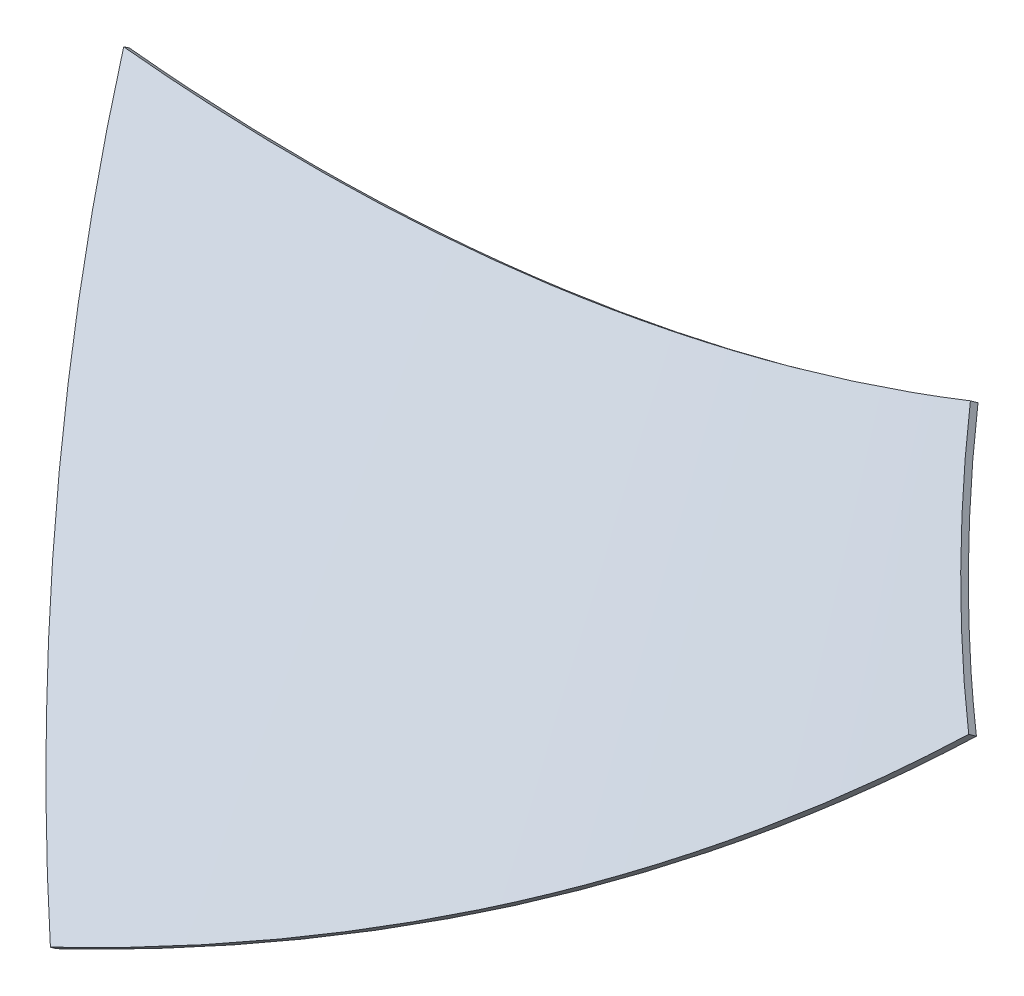
ISO-10303-21;
HEADER;
FILE_DESCRIPTION(('STEP AP214'),'2;1');
FILE_NAME('part.step','',(''),(''),'','','');
FILE_SCHEMA(('AUTOMOTIVE_DESIGN { 1 0 10303 214 1 1 1 1 }'));
ENDSEC;
DATA;
#1=APPLICATION_CONTEXT('core data for automotive mechanical design processes');
#2=APPLICATION_PROTOCOL_DEFINITION('international standard','automotive_design',2000,#1);
#3=PRODUCT_CONTEXT('',#1,'mechanical');
#4=PRODUCT('Part','Part','',(#3));
#5=PRODUCT_RELATED_PRODUCT_CATEGORY('part','',(#4));
#6=PRODUCT_DEFINITION_FORMATION('','',#4);
#7=PRODUCT_DEFINITION_CONTEXT('part definition',#1,'design');
#8=PRODUCT_DEFINITION('design','',#6,#7);
#9=PRODUCT_DEFINITION_SHAPE('','',#8);
#10=(LENGTH_UNIT() NAMED_UNIT(*) SI_UNIT(.MILLI.,.METRE.));
#11=(NAMED_UNIT(*) PLANE_ANGLE_UNIT() SI_UNIT($,.RADIAN.));
#12=(NAMED_UNIT(*) SI_UNIT($,.STERADIAN.) SOLID_ANGLE_UNIT());
#13=UNCERTAINTY_MEASURE_WITH_UNIT(LENGTH_MEASURE(1.E-05),#10,'distance_accuracy_value','');
#14=(GEOMETRIC_REPRESENTATION_CONTEXT(3) GLOBAL_UNCERTAINTY_ASSIGNED_CONTEXT((#13)) GLOBAL_UNIT_ASSIGNED_CONTEXT((#10,
#11,#12)) REPRESENTATION_CONTEXT('',''));
#15=CARTESIAN_POINT('',(0.,0.,0.));
#16=DIRECTION('',(0.,0.,1.));
#17=DIRECTION('',(1.,0.,0.));
#18=AXIS2_PLACEMENT_3D('',#15,#16,#17);
#19=CARTESIAN_POINT('',(94.4818654218824,-98.1003673578218,-2.70380006520989));
#20=DIRECTION('',(0.,0.,1.));
#21=DIRECTION('',(1.,0.,0.));
#22=AXIS2_PLACEMENT_3D('',#19,#20,#21);
#23=CONICAL_SURFACE('',#22,60.589736480619,0.959931088596881);
#24=CARTESIAN_POINT('',(96.4880135777411,-158.581065078934,-2.75685890943691));
#25=CARTESIAN_POINT('',(96.611973083159,-158.536098155912,-2.78545031076675));
#26=CARTESIAN_POINT('',(96.735762505001,-158.490685582059,-2.81408465067395));
#27=CARTESIAN_POINT('',(97.3538903835174,-158.261387160322,-2.95747721402224));
#28=CARTESIAN_POINT('',(97.8456316054258,-158.070844896009,-3.07286590443215));
#29=CARTESIAN_POINT('',(98.8231847628233,-157.675813719192,-3.30487087558326));
#30=CARTESIAN_POINT('',(99.3089967048294,-157.47132482202,-3.42148715497492));
#31=CARTESIAN_POINT('',(100.032955822554,-157.154311360902,-3.59725798886514));
#32=CARTESIAN_POINT('',(100.273473545656,-157.04693103635,-3.65598713760823));
#33=CARTESIAN_POINT('',(100.992650702399,-156.719655292125,-3.83260195477698));
#34=CARTESIAN_POINT('',(101.46889835673,-156.494640157947,-3.95090640902834));
#35=CARTESIAN_POINT('',(102.178078420458,-156.147058418285,-4.12913641934771));
#36=CARTESIAN_POINT('',(102.413597961288,-156.029525845329,-4.18867310426497));
#37=CARTESIAN_POINT('',(103.117565372375,-155.671892342563,-4.36768167091046));
#38=CARTESIAN_POINT('',(103.583386803133,-155.426772272707,-4.48754331511361));
#39=CARTESIAN_POINT('',(104.276485858068,-155.049224319688,-4.66806826639668));
#40=CARTESIAN_POINT('',(104.506571646856,-154.921735243958,-4.72836309399997));
#41=CARTESIAN_POINT('',(105.194000339028,-154.534315947108,-4.90963591610438));
#42=CARTESIAN_POINT('',(105.648479724323,-154.269451987948,-5.03099328789196));
#43=CARTESIAN_POINT('',(106.549425910531,-153.726850279126,-5.27461395592797));
#44=CARTESIAN_POINT('',(106.995892720654,-153.449112544262,-5.39687725113489));
#45=CARTESIAN_POINT('',(107.88053901956,-152.881064047426,-5.64218104309719));
#46=CARTESIAN_POINT('',(108.318718517499,-152.590753299342,-5.76522153899381));
#47=CARTESIAN_POINT('',(109.186482298034,-151.997834605536,-6.01197451991461));
#48=CARTESIAN_POINT('',(109.616066586712,-151.695226668514,-6.13568700446332));
#49=CARTESIAN_POINT('',(110.466329581083,-151.077976861834,-6.38369108438574));
#50=CARTESIAN_POINT('',(110.887008289661,-150.763334996076,-6.50798267957184));
#51=CARTESIAN_POINT('',(111.719137295085,-150.122265681434,-6.7570682564138));
#52=CARTESIAN_POINT('',(112.130587591478,-149.795838231971,-6.88186223809436));
#53=CARTESIAN_POINT('',(112.943920776406,-149.131441437413,-7.13188666770863));
#54=CARTESIAN_POINT('',(113.34580366097,-148.793472087527,-7.25711711582348));
#55=CARTESIAN_POINT('',(114.389854216331,-147.889604387268,-7.58703759016738));
#56=CARTESIAN_POINT('',(115.023806806948,-147.314315648022,-7.79205752139726));
#57=CARTESIAN_POINT('',(115.643847894272,-146.724436778562,-7.99752302693634));
#58=B_SPLINE_CURVE_WITH_KNOTS('',3,(#24,#25,#26,#27,#28,#29,#30,#31,#32,#33,#34,#35,#36,#37,#38,
#39,#40,#41,#42,#43,#44,#45,#46,#47,#48,#49,#50,#51,#52,#53,#54,#55,#56,#57),.UNSPECIFIED.,.F.,
.F.,(4,2,2,2,2,2,2,2,2,2,2,2,2,2,2,2,4),(0.,0.404785729390347,2.0240803926348,3.64337327590641,
4.45295954434955,6.07225127759372,6.88183752026706,8.50112976505182,9.31071617964502,
10.9300101046938,12.5493021683875,14.1685924431816,15.7878815723887,17.4071701770164,
19.0264588611892,20.6457482174725,23.2857201357102),.UNSPECIFIED.);
#59=CARTESIAN_POINT('',(96.4880135777409,-158.581065078934,-2.75685890943712));
#60=VERTEX_POINT('',#59);
#61=CARTESIAN_POINT('',(115.643847894272,-146.724436778563,-7.99752302693613));
#62=VERTEX_POINT('',#61);
#63=EDGE_CURVE('E24',#60,#62,#58,.T.);
#64=ORIENTED_EDGE('',*,*,#63,.T.);
#65=CARTESIAN_POINT('',(115.643847894272,-146.724436778562,-7.9975230269365));
#66=CARTESIAN_POINT('',(115.554341699538,-146.653007892088,-8.06839270908249));
#67=CARTESIAN_POINT('',(115.465795574571,-146.580632329067,-8.13954595753018));
#68=CARTESIAN_POINT('',(115.027647918691,-146.213960080043,-8.49686090490525));
#69=CARTESIAN_POINT('',(114.692591598713,-145.905905829666,-8.78704423252339));
#70=CARTESIAN_POINT('',(114.186400189379,-145.39698733341,-9.25266430868672));
#71=CARTESIAN_POINT('',(114.004751157376,-145.204444184394,-9.4259560292549));
#72=CARTESIAN_POINT('',(113.753708512051,-144.924087671532,-9.67445744911139));
#73=CARTESIAN_POINT('',(113.679748112031,-144.839620500977,-9.74885104371534));
#74=CARTESIAN_POINT('',(113.355407984653,-144.460832955649,-10.0804026850158));
#75=CARTESIAN_POINT('',(113.116023179199,-144.158591084157,-10.339494622409));
#76=CARTESIAN_POINT('',(112.823356657321,-143.758721958951,-10.6757424971134));
#77=CARTESIAN_POINT('',(112.758587469315,-143.668137343023,-10.7514987942408));
#78=CARTESIAN_POINT('',(112.479793256558,-143.268909531308,-11.083580757449));
#79=CARTESIAN_POINT('',(112.27685079085,-142.953634485805,-11.3411894895933));
#80=CARTESIAN_POINT('',(112.086416092346,-142.631471067886,-11.5999996128498));
#81=B_SPLINE_CURVE_WITH_KNOTS('',3,(#65,#66,#67,#68,#69,#70,#71,#72,#73,#74,#75,#76,#77,#78,#79,
#80),.UNSPECIFIED.,.F.,.F.,(4,2,2,2,2,2,2,4),(0.,0.404039967201293,2.02138933713272,
2.97026784667478,3.3743046063839,4.76665393129975,5.1706901907453,6.53488990231704),.UNSPECIFIED.);
#82=CARTESIAN_POINT('',(112.086416091171,-142.631471065897,-11.5999996144474));
#83=VERTEX_POINT('',#82);
#84=EDGE_CURVE('E119',#62,#83,#81,.T.);
#85=ORIENTED_EDGE('',*,*,#84,.T.);
#86=CARTESIAN_POINT('',(112.086416090654,-142.631471063648,-11.5999996160451));
#87=CARTESIAN_POINT('',(111.9596720683,-142.681577084587,-11.5999996494662));
#88=CARTESIAN_POINT('',(111.832709173017,-142.731135971518,-11.6000047399865));
#89=CARTESIAN_POINT('',(111.196757112512,-142.976215468493,-11.6000530761272));
#90=CARTESIAN_POINT('',(110.684566965013,-143.163506841597,-11.6001649766083));
#91=CARTESIAN_POINT('',(109.654067817266,-143.520365110588,-11.6004735845157));
#92=CARTESIAN_POINT('',(109.135758825087,-143.689932029845,-11.6006702918302));
#93=CARTESIAN_POINT('',(108.093635144654,-144.011221032246,-11.6010958966198));
#94=CARTESIAN_POINT('',(107.569820462515,-144.162943135214,-11.6013247940591));
#95=CARTESIAN_POINT('',(106.517324385364,-144.448421715757,-11.6017712994815));
#96=CARTESIAN_POINT('',(105.988642994704,-144.582178209401,-11.6019889074747));
#97=CARTESIAN_POINT('',(104.927020161279,-144.831620409908,-11.6023789968192));
#98=CARTESIAN_POINT('',(104.394078721375,-144.947306128906,-11.6025514782008));
#99=CARTESIAN_POINT('',(103.592017877683,-145.107191018148,-11.6027589088337));
#100=CARTESIAN_POINT('',(103.324237436326,-145.158209631717,-11.6028195019057));
#101=CARTESIAN_POINT('',(102.519576613211,-145.304448082036,-11.6029726866723));
#102=CARTESIAN_POINT('',(101.981434340204,-145.392838024815,-11.6030366646365));
#103=CARTESIAN_POINT('',(100.902478163574,-145.551301946164,-11.6030799623007));
#104=CARTESIAN_POINT('',(100.361664260213,-145.621375926534,-11.6030592820089));
#105=CARTESIAN_POINT('',(99.2779512875505,-145.743128265875,-11.6029358242905));
#106=CARTESIAN_POINT('',(98.7350522179709,-145.794806622391,-11.602833046853));
#107=CARTESIAN_POINT('',(97.9196918632934,-145.858462832351,-11.6026274061248));
#108=CARTESIAN_POINT('',(97.6477511768085,-145.877370700853,-11.6025502856784));
#109=CARTESIAN_POINT('',(96.8314262239458,-145.927159003761,-11.6022970817865));
#110=CARTESIAN_POINT('',(96.2865980928717,-145.951098515869,-11.6020991678107));
#111=CARTESIAN_POINT('',(95.1964591744749,-145.980396498538,-11.6016733387338));
#112=CARTESIAN_POINT('',(94.6511483868119,-145.985754955988,-11.6014454236117));
#113=CARTESIAN_POINT('',(93.5606447924377,-145.977830370529,-11.6009981951222));
#114=CARTESIAN_POINT('',(93.0154519858364,-145.964547310328,-11.600778881763));
#115=CARTESIAN_POINT('',(92.1983099266502,-145.930605665116,-11.6004924205904));
#116=CARTESIAN_POINT('',(91.9260520035081,-145.916956739717,-11.6004040220244));
#117=CARTESIAN_POINT('',(90.9653752778544,-145.860514379437,-11.600129637706));
#118=CARTESIAN_POINT('',(90.2776916234555,-145.80508463259,-11.6000013307998));
#119=CARTESIAN_POINT('',(89.5914172909744,-145.734629381992,-11.5999996160451));
#120=B_SPLINE_CURVE_WITH_KNOTS('',3,(#86,#87,#88,#89,#90,#91,#92,#93,#94,#95,#96,#97,#98,#99,
#100,#101,#102,#103,#104,#105,#106,#107,#108,#109,#110,#111,#112,#113,#114,#115,#116,#117,#118,
#119),.UNSPECIFIED.,.F.,.F.,(4,2,2,2,2,2,2,2,2,2,2,2,2,2,2,2,4),(0.,0.408872021815563,
2.04458807599981,3.68030197347316,5.31601405396775,6.9517246714921,8.58743419060011,
9.40520009613759,11.0409086665513,12.6766170762268,14.3123257040699,15.1300916359074,
16.7658012978055,18.4015121139469,20.0372244475018,20.8549909751724,22.9242005441257),.UNSPECIFIED.);
#121=CARTESIAN_POINT('',(89.591417275599,-145.734629391114,-11.5999996085916));
#122=VERTEX_POINT('',#121);
#123=EDGE_CURVE('E69',#83,#122,#120,.T.);
#124=ORIENTED_EDGE('',*,*,#123,.T.);
#125=CARTESIAN_POINT('',(89.5914172602235,-145.734629400236,-11.5999996011382));
#126=CARTESIAN_POINT('',(89.6242423751454,-145.842905263165,-11.5269277917346));
#127=CARTESIAN_POINT('',(89.657561181824,-145.951077578375,-11.4539215975593));
#128=CARTESIAN_POINT('',(89.7590267062982,-146.275281650155,-11.2350972013766));
#129=CARTESIAN_POINT('',(89.8286775551572,-146.490983571597,-11.0894846303368));
#130=CARTESIAN_POINT('',(89.9362578996294,-146.813815236444,-10.8715019115283));
#131=CARTESIAN_POINT('',(89.9726379905295,-146.921313019187,-10.7989086751818));
#132=CARTESIAN_POINT('',(90.0464411372165,-147.136055144569,-10.6538728797854));
#133=CARTESIAN_POINT('',(90.0838642123462,-147.243299482468,-10.5814303235567));
#134=CARTESIAN_POINT('',(90.1979240227741,-147.565149135172,-10.3639895550856));
#135=CARTESIAN_POINT('',(90.2761769240752,-147.779346829829,-10.2192322081605));
#136=CARTESIAN_POINT('',(90.4368181895876,-148.206615599148,-9.93034170989292));
#137=CARTESIAN_POINT('',(90.5192066805409,-148.41968663906,-9.78620857782784));
#138=CARTESIAN_POINT('',(90.6877376307138,-148.844738749894,-9.49848756492304));
#139=CARTESIAN_POINT('',(90.7738804086748,-149.056719726554,-9.35489973150904));
#140=CARTESIAN_POINT('',(90.9501707894116,-149.479439923237,-9.06835661860037));
#141=CARTESIAN_POINT('',(91.0403183666039,-149.690179151182,-8.92540133507126));
#142=CARTESIAN_POINT('',(91.2247798701723,-150.110292786422,-8.64018160166898));
#143=CARTESIAN_POINT('',(91.3190937154216,-150.319667220201,-8.49791713840377));
#144=CARTESIAN_POINT('',(91.5119599561901,-150.736950213272,-8.21411584561225));
#145=CARTESIAN_POINT('',(91.6105123865721,-150.94485876049,-8.07257902208157));
#146=CARTESIAN_POINT('',(91.9124325271754,-151.566237636175,-7.64910282736837));
#147=CARTESIAN_POINT('',(92.1220902655896,-151.977423119061,-7.36825571533108));
#148=CARTESIAN_POINT('',(92.4483738531336,-152.58874114195,-6.94954756885923));
#149=CARTESIAN_POINT('',(92.5589609324709,-152.791362985321,-6.81057114311587));
#150=CARTESIAN_POINT('',(92.7840822742431,-153.194883522549,-6.53337230581276));
#151=CARTESIAN_POINT('',(92.8986160841516,-153.395782410681,-6.39514980989964));
#152=CARTESIAN_POINT('',(93.24809931907,-153.995850423052,-5.98158984943178));
#153=CARTESIAN_POINT('',(93.4889254827716,-154.392381404696,-5.70736640916333));
#154=CARTESIAN_POINT('',(93.986037646556,-155.177817775247,-5.16201613688153));
#155=CARTESIAN_POINT('',(94.2423236821119,-155.566723146654,-4.89088931197515));
#156=CARTESIAN_POINT('',(94.6382857580639,-156.143824684401,-4.48668123329447));
#157=CARTESIAN_POINT('',(94.77218836638,-156.335139785435,-4.3523654942544));
#158=CARTESIAN_POINT('',(95.158061097877,-156.875562579292,-3.97199695666763));
#159=CARTESIAN_POINT('',(95.4146449731371,-157.222099705034,-3.72694483029295));
#160=CARTESIAN_POINT('',(95.9412629514956,-157.907557859839,-3.23966318972088));
#161=CARTESIAN_POINT('',(96.2113101829381,-158.246470968195,-2.99743672647477));
#162=CARTESIAN_POINT('',(96.4880135777406,-158.581065078934,-2.75685890943739));
#163=B_SPLINE_CURVE_WITH_KNOTS('',3,(#125,#126,#127,#128,#129,#130,#131,#132,#133,#134,#135,
#136,#137,#138,#139,#140,#141,#142,#143,#144,#145,#146,#147,#148,#149,#150,#151,#152,#153,#154,
#155,#156,#157,#158,#159,#160,#161,#162),.UNSPECIFIED.,.F.,.F.,(4,2,2,2,2,2,2,2,2,2,2,2,2,2,2,2,
2,2,4),(0.,0.404064073245839,1.21225538389869,1.61640710441391,2.02056632517206,
2.83085303613015,3.64116459487806,4.45154508417221,5.26192039734496,6.07227993759839,
6.88264614441979,8.50313983491038,9.31144171549329,10.1196512237052,11.7361079255187,
13.3525683364818,14.1607184556779,15.6483286208021,17.1374188881259),.UNSPECIFIED.);
#164=EDGE_CURVE('E66',#122,#60,#163,.T.);
#165=ORIENTED_EDGE('',*,*,#164,.T.);
#166=EDGE_LOOP('',(#64,#85,#124,#165));
#167=FACE_BOUND('',#166,.T.);
#168=ADVANCED_FACE('F17',(#167),#23,.F.);
#169=CARTESIAN_POINT('',(115.690084011165,-146.830673902632,-8.16299173988276));
#170=CARTESIAN_POINT('',(115.689931416719,-146.83032328506,-8.1624456385199));
#171=CARTESIAN_POINT('',(115.689778822274,-146.829972667489,-8.16189953715704));
#172=CARTESIAN_POINT('',(115.689626227829,-146.829622049918,-8.16135343579418));
#173=CARTESIAN_POINT('',(115.67436678331,-146.7945602928,-8.10674329950826));
#174=CARTESIAN_POINT('',(115.659107338791,-146.759498535681,-8.05213316322234));
#175=CARTESIAN_POINT('',(115.643847894272,-146.724436778562,-7.99752302693642));
#176=CARTESIAN_POINT('',(112.558586517024,-149.805754607963,-7.12789737510282));
#177=CARTESIAN_POINT('',(112.558460713563,-149.805392325792,-7.12735127373996));
#178=CARTESIAN_POINT('',(112.558334910102,-149.805030043622,-7.1268051723771));
#179=CARTESIAN_POINT('',(112.558209106641,-149.804667761452,-7.12625907101424));
#180=CARTESIAN_POINT('',(112.545628760546,-149.76843954443,-7.07164893472832));
#181=CARTESIAN_POINT('',(112.533043864091,-149.732214726443,-7.0170387984424));
#182=CARTESIAN_POINT('',(112.520463517996,-149.695986509421,-6.96242866215648));
#183=CARTESIAN_POINT('',(106.407110926644,-154.406546508136,-5.31571875494062));
#184=CARTESIAN_POINT('',(106.407032780225,-154.406169904973,-5.31517265357776));
#185=CARTESIAN_POINT('',(106.406954633807,-154.405793301811,-5.3146265522149));
#186=CARTESIAN_POINT('',(106.406876487388,-154.405416698648,-5.31408045085204));
#187=CARTESIAN_POINT('',(106.399061845516,-154.367756382384,-5.25947031456612));
#188=CARTESIAN_POINT('',(106.391249186396,-154.330094887061,-5.2048601782802));
#189=CARTESIAN_POINT('',(106.383434544524,-154.292434570797,-5.15025004199428));
#190=CARTESIAN_POINT('',(99.5062074478923,-157.605314242075,-3.61624611019748));
#191=CARTESIAN_POINT('',(99.5061755553089,-157.604932704328,-3.61570000883462));
#192=CARTESIAN_POINT('',(99.5061436627255,-157.604551166582,-3.61515390747176));
#193=CARTESIAN_POINT('',(99.5061117701421,-157.604169628835,-3.6146078061089));
#194=CARTESIAN_POINT('',(99.5029225118008,-157.566015854164,-3.55999766982298));
#195=CARTESIAN_POINT('',(99.4997325080086,-157.527862414049,-3.50538753353705));
#196=CARTESIAN_POINT('',(99.4965432496673,-157.489708639379,-3.45077739725114));
#197=CARTESIAN_POINT('',(96.4918546289354,-158.696863832648,-2.9223276223833));
#198=CARTESIAN_POINT('',(96.4918419521987,-158.696481658543,-2.92178152102044));
#199=CARTESIAN_POINT('',(96.4918292754621,-158.696099484439,-2.92123541965758));
#200=CARTESIAN_POINT('',(96.4918165987255,-158.695717310334,-2.92068931829472));
#201=CARTESIAN_POINT('',(96.490548925064,-158.657499899867,-2.8660791820088));
#202=CARTESIAN_POINT('',(96.4892812514025,-158.619282489401,-2.81146904572288));
#203=CARTESIAN_POINT('',(96.4880135777411,-158.581065078934,-2.75685890943696));
#204=B_SPLINE_SURFACE_WITH_KNOTS('',3,3,((#169,#170,#171,#172,#173,#174,#175),(#176,#177,#178,
#179,#180,#181,#182),(#183,#184,#185,#186,#187,#188,#189),(#190,#191,#192,#193,#194,#195,#196),
(#197,#198,#199,#200,#201,#202,#203)),.UNSPECIFIED.,.F.,.F.,.F.,(4,1,4),(4,3,4),(0.,
0.571428571428571,1.),(-0.01,0.,1.),.UNSPECIFIED.);
#205=DIRECTION('',(-0.228891667786005,0.525926356772291,0.819152044293589));
#206=VECTOR('',#205,1.);
#207=CARTESIAN_POINT('',(115.666508169383,-146.776503487884,-8.078619079321));
#208=LINE('',#207,#206);
#209=CARTESIAN_POINT('',(115.688564045386,-146.827182959289,-8.15755361789345));
#210=VERTEX_POINT('',#209);
#211=EDGE_CURVE('E78',#210,#62,#208,.T.);
#212=DIRECTION('',(0.0190151049222333,-0.573261157002876,-0.819152044285138));
#213=VECTOR('',#212,1.);
#214=CARTESIAN_POINT('',(96.489915088233,-158.638391194634,-2.8387741138661));
#215=LINE('',#214,#213);
#216=CARTESIAN_POINT('',(96.4918166044179,-158.695717317204,-2.92068931335474));
#217=VERTEX_POINT('',#216);
#218=EDGE_CURVE('E73',#60,#217,#215,.T.);
#219=CARTESIAN_POINT('',(115.6885635851,-146.827183396807,-8.15755346593885));
#220=CARTESIAN_POINT('',(115.59439400513,-146.916694824151,-8.126465293392));
#221=CARTESIAN_POINT('',(115.499901522692,-147.005872138564,-8.09538662227511));
#222=CARTESIAN_POINT('',(115.025806065261,-147.450110408901,-7.94003111055863));
#223=CARTESIAN_POINT('',(114.641405527491,-147.800129450816,-7.8159014161905));
#224=CARTESIAN_POINT('',(113.86277045472,-148.489161555557,-7.56799529464753));
#225=CARTESIAN_POINT('',(113.468535929628,-148.828174629471,-7.44421886711691));
#226=CARTESIAN_POINT('',(112.670564894047,-149.494987090859,-7.19705631683777));
#227=CARTESIAN_POINT('',(112.266828389862,-149.822786485772,-7.07367019383038));
#228=CARTESIAN_POINT('',(111.45020961809,-150.46692567491,-6.82735181368841));
#229=CARTESIAN_POINT('',(111.037327353409,-150.783265472775,-6.70441955640965));
#230=CARTESIAN_POINT('',(109.785080485155,-151.715007793442,-6.3362969165446));
#231=CARTESIAN_POINT('',(108.932342242174,-152.312944056827,-6.09185076212332));
#232=CARTESIAN_POINT('',(107.628824006678,-153.173034560577,-5.72736003989972));
#233=CARTESIAN_POINT('',(107.19031305472,-153.453558754619,-5.60624315602401));
#234=CARTESIAN_POINT('',(106.305313396124,-154.002155973814,-5.36481117689718));
#235=CARTESIAN_POINT('',(105.858824680389,-154.270228984765,-5.2444960825607));
#236=CARTESIAN_POINT('',(105.183384137131,-154.662736444405,-5.06473951433945));
#237=CARTESIAN_POINT('',(104.957294298648,-154.791967435321,-5.00494214681324));
#238=CARTESIAN_POINT('',(104.276171280998,-155.174869028169,-4.82589443681733));
#239=CARTESIAN_POINT('',(103.818316976397,-155.423728812591,-4.70699720948179));
#240=CARTESIAN_POINT('',(103.126283454356,-155.787235810803,-4.5293965930461));
#241=CARTESIAN_POINT('',(102.894738793396,-155.906770190716,-4.47032272841767));
#242=CARTESIAN_POINT('',(101.732313647414,-156.496467842208,-4.17546925623664));
#243=CARTESIAN_POINT('',(100.788322742617,-156.942179654467,-3.94149355486325));
#244=CARTESIAN_POINT('',(99.2831607718158,-157.601364931055,-3.57668733730019));
#245=CARTESIAN_POINT('',(98.7301476086322,-157.832911319573,-3.44436138941024));
#246=CARTESIAN_POINT('',(97.616554699101,-158.277933961533,-3.18130283294718));
#247=CARTESIAN_POINT('',(97.055975295169,-158.491411029557,-3.05057015277572));
#248=CARTESIAN_POINT('',(96.4918166507773,-158.695717291485,-2.92068933027751));
#249=B_SPLINE_CURVE_WITH_KNOTS('',3,(#219,#220,#221,#222,#223,#224,#225,#226,#227,#228,#229,
#230,#231,#232,#233,#234,#235,#236,#237,#238,#239,#240,#241,#242,#243,#244,#245,#246,#247,#248),
.UNSPECIFIED.,.F.,.F.,(4,2,2,2,2,2,2,2,2,2,2,2,2,2,4),(0.,0.400777849806282,2.00403366656972,
3.60728786816518,5.21054100619003,6.81379363484071,10.0212075716662,11.6244620947902,
13.2277184465383,14.0292888255927,15.6325458212524,16.4341159661355,19.641552108236,
21.4831727118639,23.3247102492294),.UNSPECIFIED.);
#250=EDGE_CURVE('E113',#210,#217,#249,.T.);
#251=ORIENTED_EDGE('',*,*,#211,.T.);
#252=ORIENTED_EDGE('',*,*,#63,.F.);
#253=ORIENTED_EDGE('',*,*,#218,.T.);
#254=ORIENTED_EDGE('',*,*,#250,.F.);
#255=EDGE_LOOP('',(#251,#252,#253,#254));
#256=FACE_BOUND('',#255,.T.);
#257=ADVANCED_FACE('F75',(#256),#204,.F.);
#258=CARTESIAN_POINT('',(96.4918546289352,-158.696863832648,-2.92232762238349));
#259=CARTESIAN_POINT('',(96.4918419521985,-158.696481658543,-2.92178152102063));
#260=CARTESIAN_POINT('',(96.4918292754619,-158.696099484439,-2.92123541965777));
#261=CARTESIAN_POINT('',(96.4918165987253,-158.695717310334,-2.92068931829491));
#262=CARTESIAN_POINT('',(96.4905489250638,-158.657499899867,-2.86607918200903));
#263=CARTESIAN_POINT('',(96.4892812514022,-158.6192824894,-2.81146904572316));
#264=CARTESIAN_POINT('',(96.4880135777406,-158.581065078934,-2.75685890943728));
#265=CARTESIAN_POINT('',(96.4880007742366,-158.580679083088,-2.75630734706079));
#266=CARTESIAN_POINT('',(96.4879879707326,-158.580293087243,-2.7557557846843));
#267=CARTESIAN_POINT('',(96.4879751672287,-158.579907091397,-2.75520422230782));
#268=CARTESIAN_POINT('',(94.6057657856479,-156.420677750132,-4.55903629348517));
#269=CARTESIAN_POINT('',(94.6057645219542,-156.420295191998,-4.55849019212231));
#270=CARTESIAN_POINT('',(94.6057632582606,-156.419912633864,-4.55794409075945));
#271=CARTESIAN_POINT('',(94.6057619945669,-156.41953007573,-4.55739798939659));
#272=CARTESIAN_POINT('',(94.605635625201,-156.381274262315,-4.50278785311071));
#273=CARTESIAN_POINT('',(94.6055073190148,-156.343020150607,-4.44817771682482));
#274=CARTESIAN_POINT('',(94.6053809496489,-156.304764337191,-4.39356758053894));
#275=CARTESIAN_POINT('',(94.6053796733183,-156.304377953475,-4.39301601816245));
#276=CARTESIAN_POINT('',(94.6053783969877,-156.30399156976,-4.39246445578597));
#277=CARTESIAN_POINT('',(94.6053771206571,-156.303605186045,-4.39191289340948));
#278=CARTESIAN_POINT('',(92.4545172678819,-153.03379595971,-6.9006660164857));
#279=CARTESIAN_POINT('',(92.4545307711407,-153.033413642012,-6.90011991512284));
#280=CARTESIAN_POINT('',(92.4545442743994,-153.033031324314,-6.89957381375998));
#281=CARTESIAN_POINT('',(92.4545577776581,-153.032649006616,-6.89902771239712));
#282=CARTESIAN_POINT('',(92.4559081035296,-152.994417236803,-6.84441757611121));
#283=CARTESIAN_POINT('',(92.4572569168396,-152.956185414712,-6.78980743982532));
#284=CARTESIAN_POINT('',(92.4586072427111,-152.917953644899,-6.73519730353942));
#285=CARTESIAN_POINT('',(92.4586208810024,-152.917567504024,-6.73464574116293));
#286=CARTESIAN_POINT('',(92.4586345192937,-152.917181363149,-6.73409417878644));
#287=CARTESIAN_POINT('',(92.458648157585,-152.916795222274,-6.73354261640996));
#288=CARTESIAN_POINT('',(90.8472896140653,-149.41710877898,-9.35520821833375));
#289=CARTESIAN_POINT('',(90.8473165422489,-149.416727325083,-9.35466211697089));
#290=CARTESIAN_POINT('',(90.8473434704326,-149.416345871186,-9.35411601560803));
#291=CARTESIAN_POINT('',(90.8473703986162,-149.415964417289,-9.35356991424517));
#292=CARTESIAN_POINT('',(90.8500632169784,-149.377819027574,-9.29895977795926));
#293=CARTESIAN_POINT('',(90.8527589222238,-149.339673656652,-9.24434964167334));
#294=CARTESIAN_POINT('',(90.855451740586,-149.301528266938,-9.18973950538743));
#295=CARTESIAN_POINT('',(90.8554789380515,-149.301142998502,-9.18918794301094));
#296=CARTESIAN_POINT('',(90.8555061355169,-149.300757730066,-9.18863638063445));
#297=CARTESIAN_POINT('',(90.8555333329824,-149.30037246163,-9.18808481825797));
#298=CARTESIAN_POINT('',(90.1092416550836,-147.494109074151,-10.6557954017656));
#299=CARTESIAN_POINT('',(90.1092753333382,-147.493728162097,-10.6552493004027));
#300=CARTESIAN_POINT('',(90.1093090115928,-147.493347250044,-10.6547031990399));
#301=CARTESIAN_POINT('',(90.1093426898474,-147.492966337991,-10.654157097677));
#302=CARTESIAN_POINT('',(90.1127105153075,-147.454875132674,-10.5995469613911));
#303=CARTESIAN_POINT('',(90.1160751217057,-147.416784059815,-10.5449368251052));
#304=CARTESIAN_POINT('',(90.1194429471659,-147.378692854498,-10.4903266888192));
#305=CARTESIAN_POINT('',(90.119476962203,-147.378308133324,-10.4897751264427));
#306=CARTESIAN_POINT('',(90.1195109772402,-147.377923412151,-10.4892235640662));
#307=CARTESIAN_POINT('',(90.1195449922773,-147.377538690977,-10.4886720016897));
#308=CARTESIAN_POINT('',(89.7816409897169,-146.514314492544,-11.3171126533402));
#309=CARTESIAN_POINT('',(89.7816778951524,-146.513933889088,-11.3165665519773));
#310=CARTESIAN_POINT('',(89.7817148005878,-146.513553285631,-11.3160204506145));
#311=CARTESIAN_POINT('',(89.7817517060233,-146.513172682175,-11.3154743492516));
#312=CARTESIAN_POINT('',(89.7854422495699,-146.475112336545,-11.2608642129657));
#313=CARTESIAN_POINT('',(89.7891378310268,-146.437051954935,-11.2062540766797));
#314=CARTESIAN_POINT('',(89.7928283745734,-146.398991609305,-11.1516439403938));
#315=CARTESIAN_POINT('',(89.7928656490632,-146.398607199814,-11.1510923780173));
#316=CARTESIAN_POINT('',(89.792902923553,-146.398222790323,-11.1505408156408));
#317=CARTESIAN_POINT('',(89.7929401980428,-146.397838380832,-11.1499892532643));
#318=CARTESIAN_POINT('',(89.5795842576117,-145.849886012688,-11.7654683091632));
#319=CARTESIAN_POINT('',(89.5796233104329,-145.849505627852,-11.7649222078003));
#320=CARTESIAN_POINT('',(89.5796623632541,-145.849125243017,-11.7643761064375));
#321=CARTESIAN_POINT('',(89.5797014160753,-145.848744858181,-11.7638300050746));
#322=CARTESIAN_POINT('',(89.583606698195,-145.81070637463,-11.7092198687886));
#323=CARTESIAN_POINT('',(89.5875119803147,-145.772667891079,-11.6546097325027));
#324=CARTESIAN_POINT('',(89.5914172624344,-145.734629407529,-11.5999995962168));
#325=CARTESIAN_POINT('',(89.5914567057838,-145.734245218845,-11.5994480338403));
#326=CARTESIAN_POINT('',(89.5914961491332,-145.733861030161,-11.5988964714638));
#327=CARTESIAN_POINT('',(89.5915355924826,-145.733476841477,-11.5983449090873));
#328=B_SPLINE_SURFACE_WITH_KNOTS('',3,3,((#258,#259,#260,#261,#262,#263,#264,#265,#266,#267),
(#268,#269,#270,#271,#272,#273,#274,#275,#276,#277),(#278,#279,#280,#281,#282,#283,#284,#285,
#286,#287),(#288,#289,#290,#291,#292,#293,#294,#295,#296,#297),(#298,#299,#300,#301,#302,#303,
#304,#305,#306,#307),(#308,#309,#310,#311,#312,#313,#314,#315,#316,#317),(#318,#319,#320,#321,
#322,#323,#324,#325,#326,#327)),.UNSPECIFIED.,.F.,.F.,.F.,(4,1,1,1,4),(4,3,3,4),(0.,
0.571428571428571,0.785714285714286,0.857142857142857,1.),(-0.01,0.,1.,1.0101),.UNSPECIFIED.);
#329=DIRECTION('',(-0.0585792314946229,-0.570577253301046,-0.819152044282949));
#330=VECTOR('',#329,1.);
#331=CARTESIAN_POINT('',(89.5854547334968,-145.7927065149,-11.68337833437));
#332=LINE('',#331,#330);
#333=CARTESIAN_POINT('',(89.5797369258271,-145.848400072395,-11.7633350556304));
#334=VERTEX_POINT('',#333);
#335=EDGE_CURVE('E84',#122,#334,#332,.T.);
#336=CARTESIAN_POINT('',(96.4918166101107,-158.695717324075,-2.92068930841486));
#337=CARTESIAN_POINT('',(96.4173813964463,-158.605884213872,-2.98528436376134));
#338=CARTESIAN_POINT('',(96.3434266395737,-158.515736674551,-3.04999988050416));
#339=CARTESIAN_POINT('',(95.9760086031366,-158.063411915899,-3.37420293390388));
#340=CARTESIAN_POINT('',(95.6897371587724,-157.69662290474,-3.63545934627573));
#341=CARTESIAN_POINT('',(95.1316521648339,-156.953128372536,-4.16211289570355));
#342=CARTESIAN_POINT('',(94.8598789123629,-156.576399161823,-4.42751916640665));
#343=CARTESIAN_POINT('',(94.3314900813696,-155.814655642025,-4.96159877669377));
#344=CARTESIAN_POINT('',(94.0748757150637,-155.429640673701,-5.23027237549143));
#345=CARTESIAN_POINT('',(93.5768713497685,-154.652019123997,-5.77068358411697));
#346=CARTESIAN_POINT('',(93.3354809330796,-154.25941275129,-6.04242110963855));
#347=CARTESIAN_POINT('',(92.8681041705351,-153.467193066689,-6.58883171822235));
#348=CARTESIAN_POINT('',(92.6421163029773,-153.067580451898,-6.86350450818306));
#349=CARTESIAN_POINT('',(92.315242657829,-152.463827781758,-7.27729403870548));
#350=CARTESIAN_POINT('',(92.2084399422548,-152.262131994332,-7.41533156458952));
#351=CARTESIAN_POINT('',(91.9987955408799,-151.857146672393,-7.69214049712494));
#352=CARTESIAN_POINT('',(91.8959543196161,-151.653856954314,-7.83091198768643));
#353=CARTESIAN_POINT('',(91.6943283384081,-151.245754002113,-8.1091782401056));
#354=CARTESIAN_POINT('',(91.5955437294668,-151.040940711612,-8.24867302866998));
#355=CARTESIAN_POINT('',(91.402108574657,-150.629859830667,-8.52837664279359));
#356=CARTESIAN_POINT('',(91.3074579655241,-150.423592262533,-8.66858545738909));
#357=CARTESIAN_POINT('',(91.1222499137536,-150.009693478436,-8.94968808523022));
#358=CARTESIAN_POINT('',(91.0316924471912,-149.802062270451,-9.09058189446667));
#359=CARTESIAN_POINT('',(90.8545607592702,-149.385547591503,-9.37300643780444));
#360=CARTESIAN_POINT('',(90.7679864453818,-149.176664149758,-9.51453715702622));
#361=CARTESIAN_POINT('',(90.5985395240384,-148.75777961233,-9.79815900080642));
#362=CARTESIAN_POINT('',(90.5156669238598,-148.547778514451,-9.9402501264658));
#363=CARTESIAN_POINT('',(90.3557747598594,-148.131913936866,-10.2214759691299));
#364=CARTESIAN_POINT('',(90.2786609687924,-147.926077154593,-10.3605965147538));
#365=CARTESIAN_POINT('',(90.1284363707184,-147.513358414175,-10.6394454932837));
#366=CARTESIAN_POINT('',(90.055325539079,-147.306476462471,-10.7791739224432));
#367=CARTESIAN_POINT('',(89.9129239828053,-146.891564310497,-11.0593313145384));
#368=CARTESIAN_POINT('',(89.8436369739802,-146.683533202156,-11.1997608191497));
#369=CARTESIAN_POINT('',(89.7088615640545,-146.266599035739,-11.4811553897058));
#370=CARTESIAN_POINT('',(89.6433732228979,-146.057695963959,-11.6221204640646));
#371=CARTESIAN_POINT('',(89.57973685045,-145.848400214536,-11.7633349512188));
#372=B_SPLINE_CURVE_WITH_KNOTS('',3,(#336,#337,#338,#339,#340,#341,#342,#343,#344,#345,#346,
#347,#348,#349,#350,#351,#352,#353,#354,#355,#356,#357,#358,#359,#360,#361,#362,#363,#364,#365,
#366,#367,#368,#369,#370,#371),.UNSPECIFIED.,.F.,.F.,(4,2,2,2,2,2,2,2,2,2,2,2,2,2,2,2,2,4),(0.,
0.400064411548764,2.00054431917339,3.605262827626,5.21010948799447,6.81491209701954,
8.41955592829702,9.21970315689874,10.0199439293397,10.8202144629305,11.6204727453449,
12.4207263495796,13.220961354282,14.0211979318889,14.8015693749676,15.581936015408,
16.3630480888567,17.1441724851253),.UNSPECIFIED.);
#373=EDGE_CURVE('E81',#217,#334,#372,.T.);
#374=ORIENTED_EDGE('',*,*,#218,.F.);
#375=ORIENTED_EDGE('',*,*,#164,.F.);
#376=ORIENTED_EDGE('',*,*,#335,.T.);
#377=ORIENTED_EDGE('',*,*,#373,.F.);
#378=EDGE_LOOP('',(#374,#375,#376,#377));
#379=FACE_BOUND('',#378,.T.);
#380=ADVANCED_FACE('F79',(#379),#328,.F.);
#381=CARTESIAN_POINT('',(89.5794921789439,-145.850783377848,-11.76675666874));
#382=CARTESIAN_POINT('',(89.5795619332125,-145.850103952769,-11.7657812487793));
#383=CARTESIAN_POINT('',(89.5796316874811,-145.849424527691,-11.7648058288185));
#384=CARTESIAN_POINT('',(89.5797014417496,-145.848745102612,-11.7638304088578));
#385=CARTESIAN_POINT('',(89.5836067238496,-145.810706619059,-11.7092202725719));
#386=CARTESIAN_POINT('',(89.5875120059497,-145.772668135506,-11.6546101362859));
#387=CARTESIAN_POINT('',(89.5914172880498,-145.734629651953,-11.6));
#388=CARTESIAN_POINT('',(89.5914570384135,-145.734242472867,-11.5994441444375));
#389=CARTESIAN_POINT('',(89.5914967887772,-145.73385529378,-11.5988882888751));
#390=CARTESIAN_POINT('',(89.5915365391408,-145.733468114694,-11.5983324333126));
#391=CARTESIAN_POINT('',(97.2001967350402,-146.633175583997,-11.76675666874));
#392=CARTESIAN_POINT('',(97.2001580462468,-146.632484919146,-11.7657812487793));
#393=CARTESIAN_POINT('',(97.2001193574534,-146.631794254295,-11.7648058288185));
#394=CARTESIAN_POINT('',(97.20008066866,-146.631103589444,-11.7638304088578));
#395=CARTESIAN_POINT('',(97.1979146269902,-146.592435832828,-11.7092202725719));
#396=CARTESIAN_POINT('',(97.1957503565154,-146.553786110582,-11.6546101362859));
#397=CARTESIAN_POINT('',(97.1935843148455,-146.515118353966,-11.6));
#398=CARTESIAN_POINT('',(97.1935622675409,-146.514724769751,-11.5994441444375));
#399=CARTESIAN_POINT('',(97.1935402202362,-146.514331185537,-11.5988882888751));
#400=CARTESIAN_POINT('',(97.1935181729316,-146.513937601322,-11.5983324333126));
#401=CARTESIAN_POINT('',(105.005094210692,-145.556499261983,-11.76675666874));
#402=CARTESIAN_POINT('',(105.004944460187,-145.555823917963,-11.7657812487793));
#403=CARTESIAN_POINT('',(105.004794709682,-145.555148573943,-11.7648058288185));
#404=CARTESIAN_POINT('',(105.004644959177,-145.554473229923,-11.7638304088578));
#405=CARTESIAN_POINT('',(104.996260985284,-145.516663229658,-11.7092202725719));
#406=CARTESIAN_POINT('',(104.987880189071,-145.478871069742,-11.6546101362859));
#407=CARTESIAN_POINT('',(104.979496215179,-145.441061069477,-11.6));
#408=CARTESIAN_POINT('',(104.979410877935,-145.440676216034,-11.5994441444375));
#409=CARTESIAN_POINT('',(104.979325540691,-145.440291362591,-11.5988882888751));
#410=CARTESIAN_POINT('',(104.979240203447,-145.439906509148,-11.5983324333126));
#411=CARTESIAN_POINT('',(112.129343991164,-142.740058145789,-11.76675666874));
#412=CARTESIAN_POINT('',(112.129092890954,-142.739422982204,-11.7657812487793));
#413=CARTESIAN_POINT('',(112.128841790743,-142.738787818619,-11.7648058288185));
#414=CARTESIAN_POINT('',(112.128590690533,-142.738152655034,-11.7638304088578));
#415=CARTESIAN_POINT('',(112.11453252352,-142.702592207912,-11.7092202725719));
#416=CARTESIAN_POINT('',(112.100474356507,-142.66703176079,-11.6546101362859));
#417=CARTESIAN_POINT('',(112.086416189494,-142.631471313668,-11.6));
#418=CARTESIAN_POINT('',(112.086273096822,-142.631109357561,-11.5994441444375));
#419=CARTESIAN_POINT('',(112.08613000415,-142.630747401454,-11.5988882888751));
#420=CARTESIAN_POINT('',(112.085986911477,-142.630385445347,-11.5983324333126));
#421=B_SPLINE_SURFACE_WITH_KNOTS('',3,3,((#381,#382,#383,#384,#385,#386,#387,#388,#389,#390),
(#391,#392,#393,#394,#395,#396,#397,#398,#399,#400),(#401,#402,#403,#404,#405,#406,#407,#408,
#409,#410),(#411,#412,#413,#414,#415,#416,#417,#418,#419,#420)),.UNSPECIFIED.,.F.,.F.,.F.,(4,4),
(4,3,3,4),(0.,1.),(-0.0178615185217231,0.,1.,1.01017861518522),.UNSPECIFIED.);
#422=DIRECTION('',(0.210872505194883,-0.533406706830139,-0.819152044288153));
#423=VECTOR('',#422,1.);
#424=CARTESIAN_POINT('',(112.107292470308,-142.684278331774,-11.6810956653055));
#425=LINE('',#424,#423);
#426=CARTESIAN_POINT('',(112.1277789781,-142.736099436835,-11.7606773996097));
#427=VERTEX_POINT('',#426);
#428=EDGE_CURVE('E45',#83,#427,#425,.T.);
#429=CARTESIAN_POINT('',(89.5797369861849,-145.848400078598,-11.7633350556398));
#430=CARTESIAN_POINT('',(89.7153117367393,-145.862333761606,-11.7633558068636));
#431=CARTESIAN_POINT('',(89.8509490085355,-145.875682438622,-11.7633809560978));
#432=CARTESIAN_POINT('',(90.5294950396101,-145.939509024261,-11.7635263085445));
#433=CARTESIAN_POINT('',(91.0732568299314,-145.981212653629,-11.7637052995414));
#434=CARTESIAN_POINT('',(92.1618734832759,-146.045930871502,-11.7641272290231));
#435=CARTESIAN_POINT('',(92.7067283448666,-146.068945484481,-11.7643701674241));
#436=CARTESIAN_POINT('',(93.7969102771613,-146.096335460197,-11.7648675373834));
#437=CARTESIAN_POINT('',(94.3422373473432,-146.10071084351,-11.7651219689289));
#438=CARTESIAN_POINT('',(95.4327179124757,-146.09087872531,-11.7655989597092));
#439=CARTESIAN_POINT('',(95.9778714075802,-146.076671240328,-11.7658215189723));
#440=CARTESIAN_POINT('',(97.0673942591365,-146.029736061526,-11.7662009936095));
#441=CARTESIAN_POINT('',(97.6117636161126,-145.997008380094,-11.7663579090275));
#442=CARTESIAN_POINT('',(98.4271807852707,-145.934087096665,-11.766526617287));
#443=CARTESIAN_POINT('',(98.6987823516749,-145.910810010399,-11.7665717419232));
#444=CARTESIAN_POINT('',(99.5130151715176,-145.834069478677,-11.7666708248379));
#445=CARTESIAN_POINT('',(100.055015889299,-145.773700288057,-11.7666884745784));
#446=CARTESIAN_POINT('',(101.136642700627,-145.634634867442,-11.76661854104));
#447=CARTESIAN_POINT('',(101.676268794414,-145.5559386393,-11.7665309577718));
#448=CARTESIAN_POINT('',(102.752562096436,-145.380300953633,-11.7662530005901));
#449=CARTESIAN_POINT('',(103.289229304291,-145.283359493769,-11.7660626266635));
#450=CARTESIAN_POINT('',(104.091463726823,-145.124350321285,-11.7657099628888));
#451=CARTESIAN_POINT('',(104.358399831235,-145.06908444323,-11.7655812332245));
#452=CARTESIAN_POINT('',(105.157820851471,-144.89648473252,-11.765165330126));
#453=CARTESIAN_POINT('',(105.688860315448,-144.772359328133,-11.7648484640491));
#454=CARTESIAN_POINT('',(106.746392727505,-144.506117769835,-11.7641635520587));
#455=CARTESIAN_POINT('',(107.272885672423,-144.364001603418,-11.7637955061096));
#456=CARTESIAN_POINT('',(108.320732532853,-144.061882588762,-11.7630465624472));
#457=CARTESIAN_POINT('',(108.842086443659,-143.901879724151,-11.762665664722));
#458=CARTESIAN_POINT('',(109.619717365721,-143.648576621645,-11.7621205348031));
#459=CARTESIAN_POINT('',(109.878180350758,-143.561930882675,-11.7619432032457));
#460=CARTESIAN_POINT('',(110.805171924167,-143.242298140939,-11.7613338814233));
#461=CARTESIAN_POINT('',(111.469327850524,-142.996605392713,-11.7609475150526));
#462=CARTESIAN_POINT('',(112.127777935034,-142.73609991065,-11.7606773602366));
#463=B_SPLINE_CURVE_WITH_KNOTS('',3,(#429,#430,#431,#432,#433,#434,#435,#436,#437,#438,#439,
#440,#441,#442,#443,#444,#445,#446,#447,#448,#449,#450,#451,#452,#453,#454,#455,#456,#457,#458,
#459,#460,#461,#462),.UNSPECIFIED.,.F.,.F.,(4,2,2,2,2,2,2,2,2,2,2,2,2,2,2,2,4),(0.,
0.408872009450672,2.04458727987425,3.68030040816374,5.31601173078751,6.95172159831943,
8.58743037175986,9.40519618427308,11.04090400869,12.6766116675704,14.3123195361851,
15.1300853719819,16.7657942553651,18.4015042759037,20.0372157936085,20.8549822169998,
22.9788418860483),.UNSPECIFIED.);
#464=EDGE_CURVE('E36',#334,#427,#463,.T.);
#465=ORIENTED_EDGE('',*,*,#335,.F.);
#466=ORIENTED_EDGE('',*,*,#123,.F.);
#467=ORIENTED_EDGE('',*,*,#428,.T.);
#468=ORIENTED_EDGE('',*,*,#464,.F.);
#469=EDGE_LOOP('',(#465,#466,#467,#468));
#470=FACE_BOUND('',#469,.T.);
#471=ADVANCED_FACE('F138',(#470),#421,.F.);
#472=CARTESIAN_POINT('',(112.101599388542,-142.692517894603,-11.8004941054633));
#473=CARTESIAN_POINT('',(112.087547370314,-142.656955009514,-11.7458839691774));
#474=CARTESIAN_POINT('',(112.073495405429,-142.621392124811,-11.6912738328915));
#475=CARTESIAN_POINT('',(112.059443387201,-142.585829239723,-11.6366636966055));
#476=CARTESIAN_POINT('',(112.059302867019,-142.585473610872,-11.6361175952427));
#477=CARTESIAN_POINT('',(112.059162346836,-142.585117982021,-11.6355714938798));
#478=CARTESIAN_POINT('',(112.059021826654,-142.58476235317,-11.6350253925169));
#479=CARTESIAN_POINT('',(112.110596456805,-142.707729399456,-11.7882727442351));
#480=CARTESIAN_POINT('',(112.096542388982,-142.672167327023,-11.7336626079492));
#481=CARTESIAN_POINT('',(112.082488356722,-142.636605254847,-11.6790524716633));
#482=CARTESIAN_POINT('',(112.068434288899,-142.601043182414,-11.6244423353773));
#483=CARTESIAN_POINT('',(112.06829374822,-142.60068756169,-11.6238962340145));
#484=CARTESIAN_POINT('',(112.068153207542,-142.600331940966,-11.6233501326516));
#485=CARTESIAN_POINT('',(112.068012666864,-142.599976320241,-11.6228040312887));
#486=CARTESIAN_POINT('',(112.119593525069,-142.72294090431,-11.7760513830069));
#487=CARTESIAN_POINT('',(112.105537407651,-142.687379644533,-11.721441246721));
#488=CARTESIAN_POINT('',(112.091481308014,-142.651818384884,-11.6668311104351));
#489=CARTESIAN_POINT('',(112.077425190596,-142.616257125106,-11.6122209741491));
#490=CARTESIAN_POINT('',(112.077284629422,-142.615901512508,-11.6116748727862));
#491=CARTESIAN_POINT('',(112.077144068248,-142.615545899911,-11.6111287714234));
#492=CARTESIAN_POINT('',(112.077003507074,-142.615190287313,-11.6105826700605));
#493=CARTESIAN_POINT('',(112.128590593332,-142.738152409164,-11.7638300217787));
#494=CARTESIAN_POINT('',(112.114532426319,-142.702591962042,-11.7092198854928));
#495=CARTESIAN_POINT('',(112.100474259307,-142.66703151492,-11.6546097492069));
#496=CARTESIAN_POINT('',(112.086416092294,-142.631471067798,-11.5999996129209));
#497=CARTESIAN_POINT('',(112.086275510624,-142.631115463327,-11.599453511558));
#498=CARTESIAN_POINT('',(112.086134928954,-142.630759858856,-11.5989074101952));
#499=CARTESIAN_POINT('',(112.085994347284,-142.630404254384,-11.5983613088323));
#500=CARTESIAN_POINT('',(113.028297419659,-144.259302894548,-10.5416938989582));
#501=CARTESIAN_POINT('',(113.014034293148,-144.22382371297,-10.4870837626723));
#502=CARTESIAN_POINT('',(112.999769388579,-144.188344518557,-10.4324736263864));
#503=CARTESIAN_POINT('',(112.985506262068,-144.152865336979,-10.3778634901004));
#504=CARTESIAN_POINT('',(112.985363630803,-144.152510545163,-10.3773173887375));
#505=CARTESIAN_POINT('',(112.985220999538,-144.152155753347,-10.3767712873747));
#506=CARTESIAN_POINT('',(112.985078368273,-144.151800961532,-10.3762251860118));
#507=CARTESIAN_POINT('',(114.23763730684,-145.673051605776,-9.30963726457907));
#508=CARTESIAN_POINT('',(114.222951998334,-145.637740160423,-9.25502712829314));
#509=CARTESIAN_POINT('',(114.208265871359,-145.602428516112,-9.20041699200721));
#510=CARTESIAN_POINT('',(114.193580562853,-145.567117070758,-9.14580685572127));
#511=CARTESIAN_POINT('',(114.193433709768,-145.566763956304,-9.14526075435841));
#512=CARTESIAN_POINT('',(114.193286856683,-145.566410841851,-9.14471465299555));
#513=CARTESIAN_POINT('',(114.193140003598,-145.566057727397,-9.14416855163269));
#514=CARTESIAN_POINT('',(115.689626227829,-146.829622049918,-8.16135343579418));
#515=CARTESIAN_POINT('',(115.67436678331,-146.7945602928,-8.10674329950825));
#516=CARTESIAN_POINT('',(115.659107338791,-146.759498535681,-8.05213316322232));
#517=CARTESIAN_POINT('',(115.643847894272,-146.724436778562,-7.99752302693638));
#518=CARTESIAN_POINT('',(115.643695299827,-146.724086160991,-7.99697692557352));
#519=CARTESIAN_POINT('',(115.643542705382,-146.72373554342,-7.99643082421066));
#520=CARTESIAN_POINT('',(115.643390110936,-146.723384925848,-7.9958847228478));
#521=B_SPLINE_SURFACE_WITH_KNOTS('',3,3,((#472,#473,#474,#475,#476,#477,#478),(#479,#480,#481,
#482,#483,#484,#485),(#486,#487,#488,#489,#490,#491,#492),(#493,#494,#495,#496,#497,#498,#499),
(#500,#501,#502,#503,#504,#505,#506),(#507,#508,#509,#510,#511,#512,#513),(#514,#515,#516,#517,
#518,#519,#520)),.UNSPECIFIED.,.F.,.F.,.F.,(4,3,4),(4,3,4),(-0.01,0.,1.),(0.,1.,1.01),.UNSPECIFIED.);
#522=CARTESIAN_POINT('',(112.127778946497,-142.736099383403,-11.7606774425443));
#523=CARTESIAN_POINT('',(112.184166520305,-142.831429149668,-11.684075455734));
#524=CARTESIAN_POINT('',(112.241674647631,-142.926182596823,-11.6075539071558));
#525=CARTESIAN_POINT('',(112.534889632953,-143.397215192289,-11.2252164294202));
#526=CARTESIAN_POINT('',(112.787185358272,-143.764543626705,-10.9208093561356));
#527=CARTESIAN_POINT('',(113.190639055027,-144.29936685266,-10.4677096114268));
#528=CARTESIAN_POINT('',(113.329305846595,-144.474961730341,-10.3172478596329));
#529=CARTESIAN_POINT('',(113.614856894983,-144.820491769872,-10.0176280224248));
#530=CARTESIAN_POINT('',(113.761741013489,-144.990427026908,-9.86846991511638));
#531=CARTESIAN_POINT('',(114.182950617281,-145.456317253554,-9.45426245583096));
#532=CARTESIAN_POINT('',(114.466234271204,-145.745702945317,-9.19080597903881));
#533=CARTESIAN_POINT('',(114.91023817165,-146.163720331593,-8.79995119102013));
#534=CARTESIAN_POINT('',(115.061494687734,-146.300442997483,-8.6703280945043));
#535=CARTESIAN_POINT('',(115.370309463822,-146.568174830742,-8.41269708725518));
#536=CARTESIAN_POINT('',(115.527867770654,-146.699183955642,-8.28468918853295));
#537=CARTESIAN_POINT('',(115.6885642271,-146.827182299894,-8.15755399023429));
#538=B_SPLINE_CURVE_WITH_KNOTS('',3,(#522,#523,#524,#525,#526,#527,#528,#529,#530,#531,#532,
#533,#534,#535,#536,#537),.UNSPECIFIED.,.F.,.F.,(4,2,2,2,2,2,2,4),(0.,0.404036753511844,
2.02123421459898,2.82998140755452,3.63871499171336,5.08673532583119,5.8114260931473,
6.53612224630146),.UNSPECIFIED.);
#539=EDGE_CURVE('E11',#427,#210,#538,.T.);
#540=ORIENTED_EDGE('',*,*,#428,.F.);
#541=ORIENTED_EDGE('',*,*,#84,.F.);
#542=ORIENTED_EDGE('',*,*,#211,.F.);
#543=ORIENTED_EDGE('',*,*,#539,.F.);
#544=EDGE_LOOP('',(#540,#541,#542,#543));
#545=FACE_BOUND('',#544,.T.);
#546=ADVANCED_FACE('F19',(#545),#521,.F.);
#547=CARTESIAN_POINT('',(94.4856684428668,-98.2150195892213,-2.86762305109138));
#548=DIRECTION('',(0.,0.,1.));
#549=DIRECTION('',(1.,0.,0.));
#550=AXIS2_PLACEMENT_3D('',#547,#548,#549);
#551=CONICAL_SURFACE('',#550,60.5897470817279,0.959931088596881);
#552=ORIENTED_EDGE('',*,*,#464,.T.);
#553=ORIENTED_EDGE('',*,*,#539,.T.);
#554=ORIENTED_EDGE('',*,*,#250,.T.);
#555=ORIENTED_EDGE('',*,*,#373,.T.);
#556=EDGE_LOOP('',(#552,#553,#554,#555));
#557=FACE_BOUND('',#556,.T.);
#558=ADVANCED_FACE('F99',(#557),#551,.T.);
#559=CLOSED_SHELL('',(#168,#257,#380,#471,#546,#558));
#560=MANIFOLD_SOLID_BREP('B1',#559);
#561=ADVANCED_BREP_SHAPE_REPRESENTATION('',(#18,#560),#14);
#562=SHAPE_DEFINITION_REPRESENTATION(#9,#561);
ENDSEC;
END-ISO-10303-21;
